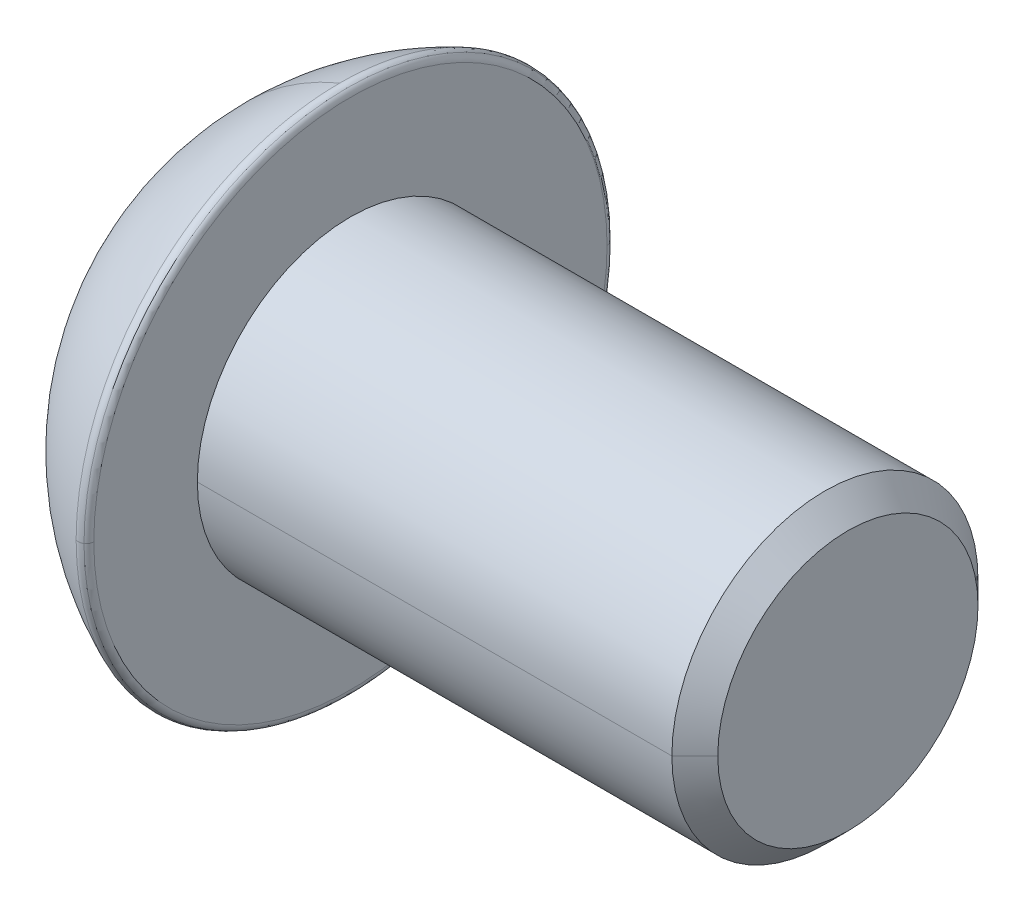
ISO-10303-21;
HEADER;
FILE_DESCRIPTION(('STEP AP214'),'2;1');
FILE_NAME('part.step','',(''),(''),'','','');
FILE_SCHEMA(('AUTOMOTIVE_DESIGN { 1 0 10303 214 1 1 1 1 }'));
ENDSEC;
DATA;
#1=APPLICATION_CONTEXT('core data for automotive mechanical design processes');
#2=APPLICATION_PROTOCOL_DEFINITION('international standard','automotive_design',2000,#1);
#3=PRODUCT_CONTEXT('',#1,'mechanical');
#4=PRODUCT('Part','Part','',(#3));
#5=PRODUCT_RELATED_PRODUCT_CATEGORY('part','',(#4));
#6=PRODUCT_DEFINITION_FORMATION('','',#4);
#7=PRODUCT_DEFINITION_CONTEXT('part definition',#1,'design');
#8=PRODUCT_DEFINITION('design','',#6,#7);
#9=PRODUCT_DEFINITION_SHAPE('','',#8);
#10=(LENGTH_UNIT() NAMED_UNIT(*) SI_UNIT(.MILLI.,.METRE.));
#11=(NAMED_UNIT(*) PLANE_ANGLE_UNIT() SI_UNIT($,.RADIAN.));
#12=(NAMED_UNIT(*) SI_UNIT($,.STERADIAN.) SOLID_ANGLE_UNIT());
#13=UNCERTAINTY_MEASURE_WITH_UNIT(LENGTH_MEASURE(1.E-05),#10,'distance_accuracy_value','');
#14=(GEOMETRIC_REPRESENTATION_CONTEXT(3) GLOBAL_UNCERTAINTY_ASSIGNED_CONTEXT((#13)) GLOBAL_UNIT_ASSIGNED_CONTEXT((#10,
#11,#12)) REPRESENTATION_CONTEXT('',''));
#15=CARTESIAN_POINT('',(0.,0.,0.));
#16=DIRECTION('',(0.,0.,1.));
#17=DIRECTION('',(1.,0.,0.));
#18=AXIS2_PLACEMENT_3D('',#15,#16,#17);
#19=CARTESIAN_POINT('',(1.6,1.25,2.165063509461));
#20=DIRECTION('',(-1.,0.,0.));
#21=DIRECTION('',(0.,0.,1.));
#22=AXIS2_PLACEMENT_3D('',#19,#20,#21);
#23=PLANE('',#22);
#24=DIRECTION('',(0.,0.,-1.));
#25=VECTOR('',#24,1.);
#26=CARTESIAN_POINT('',(1.6,-1.25,-0.721687836487));
#27=LINE('',#26,#25);
#28=CARTESIAN_POINT('',(1.6,-1.25000027522015,-0.721687677588506));
#29=VERTEX_POINT('',#28);
#30=CARTESIAN_POINT('',(1.6,-1.25,0.721687836487));
#31=VERTEX_POINT('',#30);
#32=EDGE_CURVE('E171',#29,#31,#27,.F.);
#33=ORIENTED_EDGE('',*,*,#32,.T.);
#34=DIRECTION('',(0.,-0.866025403784429,-0.500000000000017));
#35=VECTOR('',#34,1.);
#36=CARTESIAN_POINT('',(1.6,-1.25,0.721687836487));
#37=LINE('',#36,#35);
#38=CARTESIAN_POINT('',(1.6,0.,1.44337567297403));
#39=VERTEX_POINT('',#38);
#40=EDGE_CURVE('E165',#31,#39,#37,.F.);
#41=ORIENTED_EDGE('',*,*,#40,.T.);
#42=DIRECTION('',(0.,-0.866025403784429,0.500000000000017));
#43=VECTOR('',#42,1.);
#44=CARTESIAN_POINT('',(1.6,0.,1.443375672974));
#45=LINE('',#44,#43);
#46=CARTESIAN_POINT('',(1.6,1.25,0.721687836486936));
#47=VERTEX_POINT('',#46);
#48=EDGE_CURVE('E159',#39,#47,#45,.F.);
#49=ORIENTED_EDGE('',*,*,#48,.T.);
#50=DIRECTION('',(0.,0.,1.));
#51=VECTOR('',#50,1.);
#52=CARTESIAN_POINT('',(1.6,1.25,0.721687836487));
#53=LINE('',#52,#51);
#54=CARTESIAN_POINT('',(1.6,1.25,-0.721687836487));
#55=VERTEX_POINT('',#54);
#56=EDGE_CURVE('E124',#47,#55,#53,.F.);
#57=ORIENTED_EDGE('',*,*,#56,.T.);
#58=DIRECTION('',(0.,0.866025403784429,0.500000000000017));
#59=VECTOR('',#58,1.);
#60=CARTESIAN_POINT('',(1.6,1.25,-0.721687836487));
#61=LINE('',#60,#59);
#62=CARTESIAN_POINT('',(1.6,0.,-1.44337567297403));
#63=VERTEX_POINT('',#62);
#64=EDGE_CURVE('E120',#55,#63,#61,.F.);
#65=ORIENTED_EDGE('',*,*,#64,.T.);
#66=DIRECTION('',(0.,-0.866025403784429,0.500000000000017));
#67=VECTOR('',#66,1.);
#68=CARTESIAN_POINT('',(1.6,5.89521505678543E-06,-1.443379076578));
#69=LINE('',#68,#67);
#70=EDGE_CURVE('E20',#63,#29,#69,.T.);
#71=ORIENTED_EDGE('',*,*,#70,.T.);
#72=EDGE_LOOP('',(#33,#41,#49,#57,#65,#71));
#73=FACE_BOUND('',#72,.T.);
#74=ADVANCED_FACE('F17',(#73),#23,.T.);
#75=CARTESIAN_POINT('',(1.6,0.,-1.443375672974));
#76=DIRECTION('',(0.,-0.500000000000017,-0.866025403784429));
#77=DIRECTION('',(0.,0.866025403784429,-0.500000000000017));
#78=AXIS2_PLACEMENT_3D('',#75,#76,#77);
#79=PLANE('',#78);
#80=DIRECTION('',(1.,0.,0.));
#81=VECTOR('',#80,1.);
#82=CARTESIAN_POINT('',(1.6,-1.25000055044031,-0.721687518690077));
#83=LINE('',#82,#81);
#84=CARTESIAN_POINT('',(0.207033028378742,-1.24999952712232,-0.721688109502994));
#85=VERTEX_POINT('',#84);
#86=EDGE_CURVE('E136',#85,#29,#83,.T.);
#87=ORIENTED_EDGE('',*,*,#86,.T.);
#88=ORIENTED_EDGE('',*,*,#70,.F.);
#89=DIRECTION('',(-1.,0.,0.));
#90=VECTOR('',#89,1.);
#91=CARTESIAN_POINT('',(1.6,0.,-1.44337567297403));
#92=LINE('',#91,#90);
#93=CARTESIAN_POINT('',(0.207019228692631,6.36208226980284E-07,-1.44338431750813));
#94=VERTEX_POINT('',#93);
#95=EDGE_CURVE('E129',#63,#94,#92,.T.);
#96=ORIENTED_EDGE('',*,*,#95,.T.);
#97=CARTESIAN_POINT('',(0.207029974120473,7.36199577541169E-06,-1.44337992342424));
#98=CARTESIAN_POINT('',(0.22877708270887,-0.0557696443511096,-1.41117705379528));
#99=CARTESIAN_POINT('',(0.24859642471079,-0.11220494336702,-1.37859411871664));
#100=CARTESIAN_POINT('',(0.283149939912942,-0.226430788951877,-1.31264579601981));
#101=CARTESIAN_POINT('',(0.29786588663688,-0.28422542159371,-1.27927804930633));
#102=CARTESIAN_POINT('',(0.320421490831661,-0.398833581841157,-1.21310899713613));
#103=CARTESIAN_POINT('',(0.3284775622732,-0.455613840978867,-1.18032689923832));
#104=CARTESIAN_POINT('',(0.337641547328188,-0.569504152318693,-1.11457229732818));
#105=CARTESIAN_POINT('',(0.338762236662434,-0.626613404034279,-1.08160025547697));
#106=CARTESIAN_POINT('',(0.334362778173589,-0.731173382230786,-1.02123252391875));
#107=CARTESIAN_POINT('',(0.329909262767463,-0.778660904533319,-0.99381559013423));
#108=CARTESIAN_POINT('',(0.316466343827329,-0.873155793962911,-0.939258940285009));
#109=CARTESIAN_POINT('',(0.307475838793321,-0.92016304165899,-0.912119293173813));
#110=CARTESIAN_POINT('',(0.285246275436986,-1.01486945899548,-0.8574405176306));
#111=CARTESIAN_POINT('',(0.271887776803807,-1.06254703661479,-0.829913855357786));
#112=CARTESIAN_POINT('',(0.241798636437717,-1.15696261564561,-0.775402995388644));
#113=CARTESIAN_POINT('',(0.225077378691261,-1.20370284221079,-0.748417512999251));
#114=CARTESIAN_POINT('',(0.207028172057642,-1.25001198466558,-0.721680917137038));
#115=B_SPLINE_CURVE_WITH_KNOTS('',3,(#97,#98,#99,#100,#101,#102,#103,#104,#105,#106,#107,#108,
#109,#110,#111,#112,#113,#114),.UNSPECIFIED.,.F.,.F.,(4,2,2,2,2,2,2,2,4),(0.,0.204062456585252,
0.408846380866244,0.606680483702469,0.804150046069881,0.968992884767408,1.13387576362802,
1.30370847043041,1.47307366562871),.UNSPECIFIED.);
#116=EDGE_CURVE('E142',#94,#85,#115,.T.);
#117=ORIENTED_EDGE('',*,*,#116,.T.);
#118=EDGE_LOOP('',(#87,#88,#96,#117));
#119=FACE_BOUND('',#118,.T.);
#120=ADVANCED_FACE('F133',(#119),#79,.F.);
#121=CARTESIAN_POINT('',(1.6,-1.25,-0.721687836487));
#122=DIRECTION('',(0.,-1.,0.));
#123=DIRECTION('',(0.,0.,-1.));
#124=AXIS2_PLACEMENT_3D('',#121,#122,#123);
#125=PLANE('',#124);
#126=DIRECTION('',(1.,0.,0.));
#127=VECTOR('',#126,1.);
#128=CARTESIAN_POINT('',(1.6,-1.25,0.721687836487));
#129=LINE('',#128,#127);
#130=CARTESIAN_POINT('',(0.206914956676828,-1.2500917885575,0.721596826661148));
#131=VERTEX_POINT('',#130);
#132=EDGE_CURVE('E168',#131,#31,#129,.T.);
#133=ORIENTED_EDGE('',*,*,#132,.T.);
#134=ORIENTED_EDGE('',*,*,#32,.F.);
#135=ORIENTED_EDGE('',*,*,#86,.F.);
#136=CARTESIAN_POINT('',(0.207031160920142,-1.25,-0.721692822011834));
#137=CARTESIAN_POINT('',(0.228778164969564,-1.25,-0.657287160265051));
#138=CARTESIAN_POINT('',(0.248597396587641,-1.25,-0.592121368197402));
#139=CARTESIAN_POINT('',(0.283150684066797,-1.25,-0.460224891527207));
#140=CARTESIAN_POINT('',(0.29786651393915,-1.25,-0.393489488885404));
#141=CARTESIAN_POINT('',(0.320421902559959,-1.25,-0.261151510015199));
#142=CARTESIAN_POINT('',(0.328477869243167,-1.25,-0.195587347493372));
#143=CARTESIAN_POINT('',(0.337641645727044,-1.25,-0.064078215482473));
#144=CARTESIAN_POINT('',(0.338762230823647,-1.25,0.00186582973227819));
#145=CARTESIAN_POINT('',(0.33436278882051,-1.25,0.122595931634612));
#146=CARTESIAN_POINT('',(0.329909862420423,-1.25,0.177424497864469));
#147=CARTESIAN_POINT('',(0.316468963911251,-1.25,0.286527326827143));
#148=CARTESIAN_POINT('',(0.307479891091108,-1.25,0.340801451760196));
#149=CARTESIAN_POINT('',(0.285253925318202,-1.25,0.450148489971032));
#150=CARTESIAN_POINT('',(0.271897627328864,-1.25,0.505196480011395));
#151=CARTESIAN_POINT('',(0.241813359884529,-1.25,0.614207781890344));
#152=CARTESIAN_POINT('',(0.225094770487274,-1.25,0.668173661871663));
#153=CARTESIAN_POINT('',(0.207048365729195,-1.25,0.721641858838414));
#154=B_SPLINE_CURVE_WITH_KNOTS('',3,(#136,#137,#138,#139,#140,#141,#142,#143,#144,#145,#146,
#147,#148,#149,#150,#151,#152,#153),.UNSPECIFIED.,.F.,.F.,(4,2,2,2,2,2,2,2,4),(0.,
0.204062135564955,0.408845717743445,0.606679683645207,0.804149121439831,0.968976027479676,
1.13384294856399,1.30365857138595,1.47300685846462),.UNSPECIFIED.);
#155=EDGE_CURVE('E144',#85,#131,#154,.T.);
#156=ORIENTED_EDGE('',*,*,#155,.T.);
#157=EDGE_LOOP('',(#133,#134,#135,#156));
#158=FACE_BOUND('',#157,.T.);
#159=ADVANCED_FACE('F271',(#158),#125,.F.);
#160=CARTESIAN_POINT('',(1.6,-1.25,0.721687836487));
#161=DIRECTION('',(0.,-0.500000000000017,0.866025403784429));
#162=DIRECTION('',(0.,-0.866025403784429,-0.500000000000017));
#163=AXIS2_PLACEMENT_3D('',#160,#161,#162);
#164=PLANE('',#163);
#165=DIRECTION('',(1.,0.,0.));
#166=VECTOR('',#165,1.);
#167=CARTESIAN_POINT('',(1.6,0.,1.44337567297403));
#168=LINE('',#167,#166);
#169=CARTESIAN_POINT('',(0.206989347720655,-4.2355375795069E-06,1.44340553502234));
#170=VERTEX_POINT('',#169);
#171=EDGE_CURVE('E162',#170,#39,#168,.T.);
#172=ORIENTED_EDGE('',*,*,#171,.T.);
#173=ORIENTED_EDGE('',*,*,#40,.F.);
#174=ORIENTED_EDGE('',*,*,#132,.F.);
#175=CARTESIAN_POINT('',(0.206982896913737,-1.25012811650974,0.721613868385616));
#176=CARTESIAN_POINT('',(0.228733814513467,-1.19434932168866,0.753817770590641));
#177=CARTESIAN_POINT('',(0.248557253542929,-1.13791223196781,0.786401739533252));
#178=CARTESIAN_POINT('',(0.283119382722108,-1.02368253162543,0.852352287775376));
#179=CARTESIAN_POINT('',(0.297839838559711,-0.965885832290373,0.885721227694747));
#180=CARTESIAN_POINT('',(0.320404400908553,-0.851273546330508,0.951892661846116));
#181=CARTESIAN_POINT('',(0.328464944922873,-0.794491243652929,0.984675939582225));
#182=CARTESIAN_POINT('',(0.337637587260453,-0.680596477438627,1.05043311351534));
#183=CARTESIAN_POINT('',(0.338762466437565,-0.623484815433148,1.08340654694808));
#184=CARTESIAN_POINT('',(0.334369708895976,-0.518913754512515,1.14378067712005));
#185=CARTESIAN_POINT('',(0.329918170406245,-0.471417635873087,1.17120257400199));
#186=CARTESIAN_POINT('',(0.316477339176685,-0.376905587482605,1.2257691305819));
#187=CARTESIAN_POINT('',(0.307486943870036,-0.329889777239291,1.25291372128205));
#188=CARTESIAN_POINT('',(0.28525589219347,-0.23516583154672,1.30760261682636));
#189=CARTESIAN_POINT('',(0.271895715305504,-0.187479300292413,1.33513444848275));
#190=CARTESIAN_POINT('',(0.241801894918607,-0.0930461880354329,1.38965543126474));
#191=CARTESIAN_POINT('',(0.225077643219922,-0.0462973801002809,1.41664586811039));
#192=CARTESIAN_POINT('',(0.207024980398684,2.01718784551973E-05,1.44338731921352));
#193=B_SPLINE_CURVE_WITH_KNOTS('',3,(#175,#176,#177,#178,#179,#180,#181,#182,#183,#184,#185,
#186,#187,#188,#189,#190,#191,#192),.UNSPECIFIED.,.F.,.F.,(4,2,2,2,2,2,2,2,4),(0.,
0.2040719991809,0.40886586182628,0.606708635813811,0.804186721307347,0.969058629759092,
1.13397060773329,1.30383456905038,1.47323072784048),.UNSPECIFIED.);
#194=EDGE_CURVE('E258',#131,#170,#193,.T.);
#195=ORIENTED_EDGE('',*,*,#194,.T.);
#196=EDGE_LOOP('',(#172,#173,#174,#195));
#197=FACE_BOUND('',#196,.T.);
#198=ADVANCED_FACE('F265',(#197),#164,.F.);
#199=CARTESIAN_POINT('',(1.6,0.,1.443375672974));
#200=DIRECTION('',(0.,0.500000000000017,0.866025403784429));
#201=DIRECTION('',(0.,-0.866025403784429,0.500000000000017));
#202=AXIS2_PLACEMENT_3D('',#199,#200,#201);
#203=PLANE('',#202);
#204=DIRECTION('',(1.,0.,0.));
#205=VECTOR('',#204,1.);
#206=CARTESIAN_POINT('',(1.6,1.25,0.721687836486936));
#207=LINE('',#206,#205);
#208=CARTESIAN_POINT('',(0.206916762161275,1.25009288471258,0.721605510849358));
#209=VERTEX_POINT('',#208);
#210=EDGE_CURVE('E156',#209,#47,#207,.T.);
#211=ORIENTED_EDGE('',*,*,#210,.T.);
#212=ORIENTED_EDGE('',*,*,#48,.F.);
#213=ORIENTED_EDGE('',*,*,#171,.F.);
#214=CARTESIAN_POINT('',(0.207022757070233,-2.58752511379951E-05,1.44339061205721));
#215=CARTESIAN_POINT('',(0.228770468061506,0.0557514530054477,1.41118755657359));
#216=CARTESIAN_POINT('',(0.248590453556866,0.112187075237557,1.378604434886));
#217=CARTESIAN_POINT('',(0.283145312260212,0.226413617774199,1.31265570980386));
#218=CARTESIAN_POINT('',(0.29786195716185,0.284208624696181,1.27928774699964));
#219=CARTESIAN_POINT('',(0.320418912509655,0.398817427523105,1.21311832383601));
#220=CARTESIAN_POINT('',(0.328475652322654,0.455597950785069,1.18033607344599));
#221=CARTESIAN_POINT('',(0.337640943649968,0.56948883654224,1.11458113989584));
#222=CARTESIAN_POINT('',(0.338762272312536,0.626598398357914,1.08160891900825));
#223=CARTESIAN_POINT('',(0.334363439562073,0.731169527811789,1.02123474926859));
#224=CARTESIAN_POINT('',(0.329908843292613,0.77866784364366,0.993811583837007));
#225=CARTESIAN_POINT('',(0.316461753356583,0.873184069225234,0.939242615554696));
#226=CARTESIAN_POINT('',(0.307468156374413,0.920201859335002,0.912096881778119));
#227=CARTESIAN_POINT('',(0.285230652266929,1.01492972835245,0.857405721101132));
#228=CARTESIAN_POINT('',(0.271867220479929,1.06261819699437,0.829872770893481));
#229=CARTESIAN_POINT('',(0.241767061556014,1.15705505028219,0.77534962822633));
#230=CARTESIAN_POINT('',(0.225039727691357,1.20380566259134,0.748358149624863));
#231=CARTESIAN_POINT('',(0.206984110144319,1.25012500491411,0.721615664866127));
#232=B_SPLINE_CURVE_WITH_KNOTS('',3,(#214,#215,#216,#217,#218,#219,#220,#221,#222,#223,#224,
#225,#226,#227,#228,#229,#230,#231),.UNSPECIFIED.,.F.,.F.,(4,2,2,2,2,2,2,2,4),(0.,
0.204064093747883,0.408849739938516,0.606684995234939,0.804155668661313,0.969035889277068,
1.13395620739664,1.30382900629983,1.47323388376518),.UNSPECIFIED.);
#233=EDGE_CURVE('E257',#170,#209,#232,.T.);
#234=ORIENTED_EDGE('',*,*,#233,.T.);
#235=EDGE_LOOP('',(#211,#212,#213,#234));
#236=FACE_BOUND('',#235,.T.);
#237=ADVANCED_FACE('F260',(#236),#203,.F.);
#238=CARTESIAN_POINT('',(1.6,1.25,0.721687836487));
#239=DIRECTION('',(0.,1.,0.));
#240=DIRECTION('',(0.,0.,1.));
#241=AXIS2_PLACEMENT_3D('',#238,#239,#240);
#242=PLANE('',#241);
#243=DIRECTION('',(1.,0.,0.));
#244=VECTOR('',#243,1.);
#245=CARTESIAN_POINT('',(1.6,1.25,-0.721687836487));
#246=LINE('',#245,#244);
#247=CARTESIAN_POINT('',(0.20703207408439,1.25,-0.721690117334153));
#248=VERTEX_POINT('',#247);
#249=EDGE_CURVE('E130',#248,#55,#246,.T.);
#250=ORIENTED_EDGE('',*,*,#249,.T.);
#251=ORIENTED_EDGE('',*,*,#56,.F.);
#252=ORIENTED_EDGE('',*,*,#210,.F.);
#253=CARTESIAN_POINT('',(0.207045918606092,1.25,0.721649107925356));
#254=CARTESIAN_POINT('',(0.228791736113005,1.25,0.657244070684804));
#255=CARTESIAN_POINT('',(0.24860968961346,1.25,0.592078903479477));
#256=CARTESIAN_POINT('',(0.283160285960233,1.25,0.46018377139118));
#257=CARTESIAN_POINT('',(0.297874705014646,1.25,0.393449089358049));
#258=CARTESIAN_POINT('',(0.320427275942883,1.25,0.261112599124714));
#259=CARTESIAN_POINT('',(0.328481833259182,1.25,0.195549199890064));
#260=CARTESIAN_POINT('',(0.337642886973724,1.25,0.0640417324877461));
#261=CARTESIAN_POINT('',(0.33876215732379,1.25,-0.00190141176795496));
#262=CARTESIAN_POINT('',(0.33436044833659,1.25,-0.122632026396143));
#263=CARTESIAN_POINT('',(0.329906328700154,1.25,-0.177462016656382));
#264=CARTESIAN_POINT('',(0.31646291440792,1.25,-0.286567588302902));
#265=CARTESIAN_POINT('',(0.307472518691087,1.25,-0.340843031822908));
#266=CARTESIAN_POINT('',(0.28524382271332,1.25,-0.450192707233113));
#267=CARTESIAN_POINT('',(0.27188611269183,1.25,-0.505242012455315));
#268=CARTESIAN_POINT('',(0.241799042472446,1.25,-0.614255864505822));
#269=CARTESIAN_POINT('',(0.225079063234569,1.25,-0.668222979903195));
#270=CARTESIAN_POINT('',(0.207031304089396,1.25,-0.721692398118525));
#271=B_SPLINE_CURVE_WITH_KNOTS('',3,(#253,#254,#255,#256,#257,#258,#259,#260,#261,#262,#263,
#264,#265,#266,#267,#268,#269,#270),.UNSPECIFIED.,.F.,.F.,(4,2,2,2,2,2,2,2,4),(0.,
0.204059216415442,0.408839765335206,0.606670939697127,0.804137624611018,0.968969066756574,
1.13384053663494,1.30366099516533,1.47301405780841),.UNSPECIFIED.);
#272=EDGE_CURVE('E222',#209,#248,#271,.T.);
#273=ORIENTED_EDGE('',*,*,#272,.T.);
#274=EDGE_LOOP('',(#250,#251,#252,#273));
#275=FACE_BOUND('',#274,.T.);
#276=ADVANCED_FACE('F264',(#275),#242,.F.);
#277=CARTESIAN_POINT('',(1.6,1.25,-0.721687836487));
#278=DIRECTION('',(0.,0.500000000000017,-0.866025403784429));
#279=DIRECTION('',(0.,0.866025403784429,0.500000000000017));
#280=AXIS2_PLACEMENT_3D('',#277,#278,#279);
#281=PLANE('',#280);
#282=ORIENTED_EDGE('',*,*,#95,.F.);
#283=ORIENTED_EDGE('',*,*,#64,.F.);
#284=ORIENTED_EDGE('',*,*,#249,.F.);
#285=CARTESIAN_POINT('',(0.207027925070818,1.2500126183959,-0.721680551252728));
#286=CARTESIAN_POINT('',(0.228775198505051,1.19423553669676,-0.753883464386342));
#287=CARTESIAN_POINT('',(0.248594718050965,1.13780016228092,-0.786466442997143));
#288=CARTESIAN_POINT('',(0.283148607029435,1.02357415444486,-0.852414859369757));
#289=CARTESIAN_POINT('',(0.297864749677346,0.965779434844083,-0.885782656289004));
#290=CARTESIAN_POINT('',(0.320420744981027,0.851171095538349,-0.951951811838548));
#291=CARTESIAN_POINT('',(0.328477012016539,0.794390744881022,-0.984733962575239));
#292=CARTESIAN_POINT('',(0.33764137501002,0.68050023395859,-1.05048867971445));
#293=CARTESIAN_POINT('',(0.338762246878822,0.623390874223767,-1.0834607839306));
#294=CARTESIAN_POINT('',(0.334363101017464,0.51883090712891,-1.14382850907928));
#295=CARTESIAN_POINT('',(0.329909743898531,0.471343505383166,-1.1712453732603));
#296=CARTESIAN_POINT('',(0.31646715027323,0.376848845708256,-1.22580189046059));
#297=CARTESIAN_POINT('',(0.307476812306644,0.329841707203123,-1.25294147453037));
#298=CARTESIAN_POINT('',(0.285247586809734,0.235135506620879,-1.30762012493045));
#299=CARTESIAN_POINT('',(0.271889259239289,0.187458036239842,-1.33514672528923));
#300=CARTESIAN_POINT('',(0.241800452962458,0.0930426644504853,-1.38965746560745));
#301=CARTESIAN_POINT('',(0.225079358160444,0.0463025379278286,-1.41664289023727));
#302=CARTESIAN_POINT('',(0.207030308135077,-6.50533449024908E-06,-1.44337942883068));
#303=B_SPLINE_CURVE_WITH_KNOTS('',3,(#285,#286,#287,#288,#289,#290,#291,#292,#293,#294,#295,
#296,#297,#298,#299,#300,#301,#302),.UNSPECIFIED.,.F.,.F.,(4,2,2,2,2,2,2,2,4),(0.,
0.204062862845455,0.408847209358638,0.606681698856896,0.804151642418915,0.968994027378031,
1.13387645102044,1.30370867518,1.47307339413622),.UNSPECIFIED.);
#304=EDGE_CURVE('E140',#248,#94,#303,.T.);
#305=ORIENTED_EDGE('',*,*,#304,.T.);
#306=EDGE_LOOP('',(#282,#283,#284,#305));
#307=FACE_BOUND('',#306,.T.);
#308=ADVANCED_FACE('F138',(#307),#281,.F.);
#309=CARTESIAN_POINT('',(5.6843418860808E-11,0.,0.));
#310=DIRECTION('',(-1.,0.,0.));
#311=DIRECTION('',(0.,0.,1.));
#312=AXIS2_PLACEMENT_3D('',#309,#310,#311);
#313=CONICAL_SURFACE('',#312,1.74999999984493,0.976909054202291);
#314=DIRECTION('',(0.559586904163706,0.,-0.828771679468163));
#315=VECTOR('',#314,1.);
#316=CARTESIAN_POINT('',(-336923.778669411,0.,499000.));
#317=LINE('',#316,#315);
#318=CARTESIAN_POINT('',(-9.95898524079368E-12,0.,1.74999999998704));
#319=VERTEX_POINT('',#318);
#320=EDGE_CURVE('E287',#319,#170,#317,.T.);
#321=ORIENTED_EDGE('',*,*,#320,.T.);
#322=ORIENTED_EDGE('',*,*,#194,.F.);
#323=ORIENTED_EDGE('',*,*,#155,.F.);
#324=ORIENTED_EDGE('',*,*,#116,.F.);
#325=DIRECTION('',(0.559586904163706,0.,0.828771679468163));
#326=VECTOR('',#325,1.);
#327=CARTESIAN_POINT('',(-336923.778669411,6.11078570557366E-11,-499000.));
#328=LINE('',#327,#326);
#329=CARTESIAN_POINT('',(0.,0.,-1.75000000001546));
#330=VERTEX_POINT('',#329);
#331=EDGE_CURVE('E220',#94,#330,#328,.F.);
#332=ORIENTED_EDGE('',*,*,#331,.T.);
#333=CARTESIAN_POINT('',(-1.99179704815873E-11,0.,0.));
#334=DIRECTION('',(-1.,0.,0.));
#335=DIRECTION('',(0.,0.,1.));
#336=AXIS2_PLACEMENT_3D('',#333,#334,#335);
#337=CIRCLE('',#336,1.74999999995862);
#338=CARTESIAN_POINT('',(-1.99178931787647E-11,-1.74999999995958,0.));
#339=VERTEX_POINT('',#338);
#340=EDGE_CURVE('E211',#339,#330,#337,.F.);
#341=ORIENTED_EDGE('',*,*,#340,.F.);
#342=CARTESIAN_POINT('',(-1.99179704815873E-11,0.,0.));
#343=DIRECTION('',(-1.,0.,0.));
#344=DIRECTION('',(0.,0.,1.));
#345=AXIS2_PLACEMENT_3D('',#342,#343,#344);
#346=CIRCLE('',#345,1.74999999995862);
#347=EDGE_CURVE('E215',#319,#339,#346,.F.);
#348=ORIENTED_EDGE('',*,*,#347,.F.);
#349=EDGE_LOOP('',(#321,#322,#323,#324,#332,#341,#348));
#350=FACE_BOUND('',#349,.T.);
#351=ADVANCED_FACE('F238',(#350),#313,.F.);
#352=CARTESIAN_POINT('',(0.,0.,0.));
#353=DIRECTION('',(-1.,0.,0.));
#354=DIRECTION('',(0.,0.,1.));
#355=AXIS2_PLACEMENT_3D('',#352,#353,#354);
#356=CONICAL_SURFACE('',#355,1.75000000001546,0.976909054193789);
#357=ORIENTED_EDGE('',*,*,#331,.F.);
#358=ORIENTED_EDGE('',*,*,#304,.F.);
#359=ORIENTED_EDGE('',*,*,#272,.F.);
#360=ORIENTED_EDGE('',*,*,#233,.F.);
#361=ORIENTED_EDGE('',*,*,#320,.F.);
#362=CARTESIAN_POINT('',(0.,0.,0.));
#363=DIRECTION('',(-1.,0.,0.));
#364=DIRECTION('',(0.,0.,1.));
#365=AXIS2_PLACEMENT_3D('',#362,#363,#364);
#366=CIRCLE('',#365,1.75000000001546);
#367=CARTESIAN_POINT('',(0.,1.75000000001159,0.));
#368=VERTEX_POINT('',#367);
#369=EDGE_CURVE('E217',#368,#319,#366,.F.);
#370=ORIENTED_EDGE('',*,*,#369,.F.);
#371=CARTESIAN_POINT('',(0.,0.,0.));
#372=DIRECTION('',(-1.,0.,0.));
#373=DIRECTION('',(0.,0.,1.));
#374=AXIS2_PLACEMENT_3D('',#371,#372,#373);
#375=CIRCLE('',#374,1.75000000001546);
#376=EDGE_CURVE('E208',#330,#368,#375,.F.);
#377=ORIENTED_EDGE('',*,*,#376,.F.);
#378=EDGE_LOOP('',(#357,#358,#359,#360,#361,#370,#377));
#379=FACE_BOUND('',#378,.T.);
#380=ADVANCED_FACE('F233',(#379),#356,.F.);
#381=CARTESIAN_POINT('',(3.296875,0.,0.));
#382=DIRECTION('',(0.,1.,0.));
#383=DIRECTION('',(0.,0.,-1.));
#384=AXIS2_PLACEMENT_3D('',#381,#382,#383);
#385=SPHERICAL_SURFACE('',#384,3.732544007192);
#386=CARTESIAN_POINT('',(3.296875,0.,0.));
#387=DIRECTION('',(0.,0.,1.));
#388=DIRECTION('',(0.,1.,0.));
#389=AXIS2_PLACEMENT_3D('',#386,#387,#388);
#390=CIRCLE('',#389,3.732544007192);
#391=CARTESIAN_POINT('',(1.86154554501695,-3.4455353896431,0.));
#392=VERTEX_POINT('',#391);
#393=EDGE_CURVE('E214',#392,#339,#390,.F.);
#394=ORIENTED_EDGE('',*,*,#393,.F.);
#395=CARTESIAN_POINT('',(1.86154554501695,0.,0.));
#396=DIRECTION('',(-1.,0.,0.));
#397=DIRECTION('',(0.,0.,1.));
#398=AXIS2_PLACEMENT_3D('',#395,#396,#397);
#399=CIRCLE('',#398,3.4455353896431);
#400=CARTESIAN_POINT('',(1.86154554501695,0.,3.4455353896431));
#401=VERTEX_POINT('',#400);
#402=EDGE_CURVE('E202',#401,#392,#399,.F.);
#403=ORIENTED_EDGE('',*,*,#402,.F.);
#404=CARTESIAN_POINT('',(1.86154554501695,0.,0.));
#405=DIRECTION('',(-1.,0.,0.));
#406=DIRECTION('',(0.,0.,1.));
#407=AXIS2_PLACEMENT_3D('',#404,#405,#406);
#408=CIRCLE('',#407,3.4455353896431);
#409=CARTESIAN_POINT('',(1.86154554501695,3.4455353896431,0.));
#410=VERTEX_POINT('',#409);
#411=EDGE_CURVE('E198',#410,#401,#408,.F.);
#412=ORIENTED_EDGE('',*,*,#411,.F.);
#413=CARTESIAN_POINT('',(3.296875,0.,0.));
#414=DIRECTION('',(0.,0.,1.));
#415=DIRECTION('',(0.,1.,0.));
#416=AXIS2_PLACEMENT_3D('',#413,#414,#415);
#417=CIRCLE('',#416,3.732544007192);
#418=EDGE_CURVE('E207',#368,#410,#417,.F.);
#419=ORIENTED_EDGE('',*,*,#418,.F.);
#420=ORIENTED_EDGE('',*,*,#369,.T.);
#421=ORIENTED_EDGE('',*,*,#347,.T.);
#422=EDGE_LOOP('',(#394,#403,#412,#419,#420,#421));
#423=FACE_BOUND('',#422,.T.);
#424=ADVANCED_FACE('F237',(#423),#385,.T.);
#425=CARTESIAN_POINT('',(3.296875,0.,0.));
#426=DIRECTION('',(0.,1.,0.));
#427=DIRECTION('',(0.,0.,-1.));
#428=AXIS2_PLACEMENT_3D('',#425,#426,#427);
#429=SPHERICAL_SURFACE('',#428,3.732544007192);
#430=CARTESIAN_POINT('',(1.86154554501695,0.,0.));
#431=DIRECTION('',(-1.,0.,0.));
#432=DIRECTION('',(0.,0.,1.));
#433=AXIS2_PLACEMENT_3D('',#430,#431,#432);
#434=CIRCLE('',#433,3.4455353896431);
#435=CARTESIAN_POINT('',(1.86154554501695,0.,-3.4455353896431));
#436=VERTEX_POINT('',#435);
#437=EDGE_CURVE('E193',#436,#410,#434,.F.);
#438=ORIENTED_EDGE('',*,*,#437,.F.);
#439=CARTESIAN_POINT('',(1.86154554501695,0.,0.));
#440=DIRECTION('',(-1.,0.,0.));
#441=DIRECTION('',(0.,0.,1.));
#442=AXIS2_PLACEMENT_3D('',#439,#440,#441);
#443=CIRCLE('',#442,3.4455353896431);
#444=EDGE_CURVE('E205',#392,#436,#443,.F.);
#445=ORIENTED_EDGE('',*,*,#444,.F.);
#446=ORIENTED_EDGE('',*,*,#393,.T.);
#447=ORIENTED_EDGE('',*,*,#340,.T.);
#448=ORIENTED_EDGE('',*,*,#376,.T.);
#449=ORIENTED_EDGE('',*,*,#418,.T.);
#450=EDGE_LOOP('',(#438,#445,#446,#447,#448,#449));
#451=FACE_BOUND('',#450,.T.);
#452=ADVANCED_FACE('F319',(#451),#429,.T.);
#453=CARTESIAN_POINT('',(1.9,0.,0.));
#454=DIRECTION('',(-1.,0.,0.));
#455=DIRECTION('',(0.,0.,1.));
#456=AXIS2_PLACEMENT_3D('',#453,#454,#455);
#457=TOROIDAL_SURFACE('',#456,3.353224746205,0.1);
#458=CARTESIAN_POINT('',(1.9,0.,3.353224746205));
#459=DIRECTION('',(0.,1.,0.));
#460=DIRECTION('',(0.,0.,1.));
#461=AXIS2_PLACEMENT_3D('',#458,#459,#460);
#462=CIRCLE('',#461,0.1);
#463=CARTESIAN_POINT('',(1.95547321201116,0.,3.43642764729123));
#464=VERTEX_POINT('',#463);
#465=EDGE_CURVE('E201',#401,#464,#462,.T.);
#466=ORIENTED_EDGE('',*,*,#465,.F.);
#467=ORIENTED_EDGE('',*,*,#402,.T.);
#468=ORIENTED_EDGE('',*,*,#444,.T.);
#469=CARTESIAN_POINT('',(1.9,0.,-3.353224746205));
#470=DIRECTION('',(0.,-1.,0.));
#471=DIRECTION('',(0.,0.,-1.));
#472=AXIS2_PLACEMENT_3D('',#469,#470,#471);
#473=CIRCLE('',#472,0.1);
#474=CARTESIAN_POINT('',(1.95547321201116,0.,-3.43642764729123));
#475=VERTEX_POINT('',#474);
#476=EDGE_CURVE('E197',#475,#436,#473,.F.);
#477=ORIENTED_EDGE('',*,*,#476,.F.);
#478=CARTESIAN_POINT('',(1.95547321201116,0.,0.));
#479=DIRECTION('',(-1.,0.,0.));
#480=DIRECTION('',(0.,0.,1.));
#481=AXIS2_PLACEMENT_3D('',#478,#479,#480);
#482=CIRCLE('',#481,3.43642764729123);
#483=EDGE_CURVE('E196',#464,#475,#482,.F.);
#484=ORIENTED_EDGE('',*,*,#483,.F.);
#485=EDGE_LOOP('',(#466,#467,#468,#477,#484));
#486=FACE_BOUND('',#485,.T.);
#487=ADVANCED_FACE('F322',(#486),#457,.T.);
#488=CARTESIAN_POINT('',(1.9,0.,0.));
#489=DIRECTION('',(-1.,0.,0.));
#490=DIRECTION('',(0.,0.,1.));
#491=AXIS2_PLACEMENT_3D('',#488,#489,#490);
#492=TOROIDAL_SURFACE('',#491,3.353224746205,0.1);
#493=ORIENTED_EDGE('',*,*,#476,.T.);
#494=ORIENTED_EDGE('',*,*,#437,.T.);
#495=ORIENTED_EDGE('',*,*,#411,.T.);
#496=ORIENTED_EDGE('',*,*,#465,.T.);
#497=CARTESIAN_POINT('',(1.95547321201116,0.,0.));
#498=DIRECTION('',(-1.,0.,0.));
#499=DIRECTION('',(0.,0.,1.));
#500=AXIS2_PLACEMENT_3D('',#497,#498,#499);
#501=CIRCLE('',#500,3.43642764729123);
#502=EDGE_CURVE('E350',#475,#464,#501,.F.);
#503=ORIENTED_EDGE('',*,*,#502,.F.);
#504=EDGE_LOOP('',(#493,#494,#495,#496,#503));
#505=FACE_BOUND('',#504,.T.);
#506=ADVANCED_FACE('F326',(#505),#492,.T.);
#507=CARTESIAN_POINT('',(1.9,0.,0.));
#508=DIRECTION('',(-1.,0.,0.));
#509=DIRECTION('',(0.,0.,1.));
#510=AXIS2_PLACEMENT_3D('',#507,#508,#509);
#511=TOROIDAL_SURFACE('',#510,3.353224746205,0.1);
#512=CARTESIAN_POINT('',(1.9,0.,-3.353224746205));
#513=DIRECTION('',(0.,-1.,0.));
#514=DIRECTION('',(0.,0.,-1.));
#515=AXIS2_PLACEMENT_3D('',#512,#513,#514);
#516=CIRCLE('',#515,0.1);
#517=CARTESIAN_POINT('',(2.,0.,-3.353224746205));
#518=VERTEX_POINT('',#517);
#519=EDGE_CURVE('E357',#518,#475,#516,.F.);
#520=ORIENTED_EDGE('',*,*,#519,.F.);
#521=CARTESIAN_POINT('',(2.,0.,0.));
#522=DIRECTION('',(-1.,0.,0.));
#523=DIRECTION('',(0.,0.,-1.));
#524=AXIS2_PLACEMENT_3D('',#521,#522,#523);
#525=CIRCLE('',#524,3.353224746205);
#526=CARTESIAN_POINT('',(2.,0.,3.353224746205));
#527=VERTEX_POINT('',#526);
#528=EDGE_CURVE('E191',#518,#527,#525,.T.);
#529=ORIENTED_EDGE('',*,*,#528,.T.);
#530=CARTESIAN_POINT('',(1.9,0.,3.353224746205));
#531=DIRECTION('',(0.,1.,0.));
#532=DIRECTION('',(0.,0.,1.));
#533=AXIS2_PLACEMENT_3D('',#530,#531,#532);
#534=CIRCLE('',#533,0.1);
#535=EDGE_CURVE('E360',#464,#527,#534,.T.);
#536=ORIENTED_EDGE('',*,*,#535,.F.);
#537=ORIENTED_EDGE('',*,*,#483,.T.);
#538=EDGE_LOOP('',(#520,#529,#536,#537));
#539=FACE_BOUND('',#538,.T.);
#540=ADVANCED_FACE('F331',(#539),#511,.T.);
#541=CARTESIAN_POINT('',(1.9,0.,0.));
#542=DIRECTION('',(-1.,0.,0.));
#543=DIRECTION('',(0.,0.,1.));
#544=AXIS2_PLACEMENT_3D('',#541,#542,#543);
#545=TOROIDAL_SURFACE('',#544,3.353224746205,0.1);
#546=ORIENTED_EDGE('',*,*,#535,.T.);
#547=CARTESIAN_POINT('',(2.,0.,0.));
#548=DIRECTION('',(-1.,0.,0.));
#549=DIRECTION('',(0.,0.,1.));
#550=AXIS2_PLACEMENT_3D('',#547,#548,#549);
#551=CIRCLE('',#550,3.353224746205);
#552=EDGE_CURVE('E187',#527,#518,#551,.T.);
#553=ORIENTED_EDGE('',*,*,#552,.T.);
#554=ORIENTED_EDGE('',*,*,#519,.T.);
#555=ORIENTED_EDGE('',*,*,#502,.T.);
#556=EDGE_LOOP('',(#546,#553,#554,#555));
#557=FACE_BOUND('',#556,.T.);
#558=ADVANCED_FACE('F385',(#557),#545,.T.);
#559=CARTESIAN_POINT('',(8.20000000004484,0.,0.));
#560=DIRECTION('',(-1.,0.,0.));
#561=DIRECTION('',(0.,0.,1.));
#562=AXIS2_PLACEMENT_3D('',#559,#560,#561);
#563=CONICAL_SURFACE('',#562,1.99999999989587,0.785398163397448);
#564=DIRECTION('',(0.707106781186653,0.,-0.707106781186443));
#565=VECTOR('',#564,1.);
#566=CARTESIAN_POINT('',(-498989.800000148,0.,499000.));
#567=LINE('',#566,#565);
#568=CARTESIAN_POINT('',(8.2000000000026,0.,1.99999999997396));
#569=VERTEX_POINT('',#568);
#570=CARTESIAN_POINT('',(8.49999999996953,0.,1.69999999997117));
#571=VERTEX_POINT('',#570);
#572=EDGE_CURVE('E192',#569,#571,#567,.T.);
#573=ORIENTED_EDGE('',*,*,#572,.T.);
#574=CARTESIAN_POINT('',(8.49999999996953,0.,0.));
#575=DIRECTION('',(-1.,0.,0.));
#576=DIRECTION('',(0.,0.,1.));
#577=AXIS2_PLACEMENT_3D('',#574,#575,#576);
#578=CIRCLE('',#577,1.69999999997117);
#579=CARTESIAN_POINT('',(8.49999999996953,0.,-1.69999999997117));
#580=VERTEX_POINT('',#579);
#581=EDGE_CURVE('E188',#580,#571,#578,.F.);
#582=ORIENTED_EDGE('',*,*,#581,.F.);
#583=DIRECTION('',(0.707106781186653,0.,0.707106781186443));
#584=VECTOR('',#583,1.);
#585=CARTESIAN_POINT('',(-498989.800000148,6.11078570557366E-11,-499000.));
#586=LINE('',#585,#584);
#587=CARTESIAN_POINT('',(8.20000000000691,0.,-1.99999999997396));
#588=VERTEX_POINT('',#587);
#589=EDGE_CURVE('E35',#580,#588,#586,.F.);
#590=ORIENTED_EDGE('',*,*,#589,.T.);
#591=CARTESIAN_POINT('',(8.2,0.,0.));
#592=DIRECTION('',(-1.,0.,0.));
#593=DIRECTION('',(0.,0.,1.));
#594=AXIS2_PLACEMENT_3D('',#591,#592,#593);
#595=CIRCLE('',#594,2.);
#596=EDGE_CURVE('E184',#569,#588,#595,.T.);
#597=ORIENTED_EDGE('',*,*,#596,.F.);
#598=EDGE_LOOP('',(#573,#582,#590,#597));
#599=FACE_BOUND('',#598,.T.);
#600=ADVANCED_FACE('F394',(#599),#563,.T.);
#601=CARTESIAN_POINT('',(8.5,2.,0.));
#602=DIRECTION('',(1.,0.,0.));
#603=DIRECTION('',(0.,0.,-1.));
#604=AXIS2_PLACEMENT_3D('',#601,#602,#603);
#605=PLANE('',#604);
#606=CARTESIAN_POINT('',(8.49999999996953,0.,0.));
#607=DIRECTION('',(-1.,0.,0.));
#608=DIRECTION('',(0.,0.,1.));
#609=AXIS2_PLACEMENT_3D('',#606,#607,#608);
#610=CIRCLE('',#609,1.69999999997117);
#611=EDGE_CURVE('E181',#580,#571,#610,.T.);
#612=ORIENTED_EDGE('',*,*,#611,.F.);
#613=ORIENTED_EDGE('',*,*,#581,.T.);
#614=EDGE_LOOP('',(#612,#613));
#615=FACE_BOUND('',#614,.T.);
#616=ADVANCED_FACE('F397',(#615),#605,.T.);
#617=CARTESIAN_POINT('',(2.,2.,0.));
#618=DIRECTION('',(-1.,0.,0.));
#619=DIRECTION('',(0.,0.,1.));
#620=AXIS2_PLACEMENT_3D('',#617,#618,#619);
#621=PLANE('',#620);
#622=CARTESIAN_POINT('',(2.,0.,0.));
#623=DIRECTION('',(-1.,0.,0.));
#624=DIRECTION('',(0.,0.,1.));
#625=AXIS2_PLACEMENT_3D('',#622,#623,#624);
#626=CIRCLE('',#625,2.);
#627=CARTESIAN_POINT('',(2.,0.,-2.));
#628=VERTEX_POINT('',#627);
#629=CARTESIAN_POINT('',(2.,0.,2.));
#630=VERTEX_POINT('',#629);
#631=EDGE_CURVE('E185',#628,#630,#626,.F.);
#632=ORIENTED_EDGE('',*,*,#631,.F.);
#633=CARTESIAN_POINT('',(2.,0.,0.));
#634=DIRECTION('',(-1.,0.,0.));
#635=DIRECTION('',(0.,0.,1.));
#636=AXIS2_PLACEMENT_3D('',#633,#634,#635);
#637=CIRCLE('',#636,2.);
#638=EDGE_CURVE('E177',#630,#628,#637,.F.);
#639=ORIENTED_EDGE('',*,*,#638,.F.);
#640=EDGE_LOOP('',(#632,#639));
#641=FACE_BOUND('',#640,.T.);
#642=ORIENTED_EDGE('',*,*,#528,.F.);
#643=ORIENTED_EDGE('',*,*,#552,.F.);
#644=EDGE_LOOP('',(#642,#643));
#645=FACE_BOUND('',#644,.T.);
#646=ADVANCED_FACE('F400',(#641,#645),#621,.F.);
#647=CARTESIAN_POINT('',(-17.,0.,0.));
#648=DIRECTION('',(-1.,0.,0.));
#649=DIRECTION('',(0.,0.,1.));
#650=AXIS2_PLACEMENT_3D('',#647,#648,#649);
#651=CYLINDRICAL_SURFACE('',#650,2.);
#652=DIRECTION('',(-1.,0.,0.));
#653=VECTOR('',#652,1.);
#654=CARTESIAN_POINT('',(-17.,0.,2.));
#655=LINE('',#654,#653);
#656=EDGE_CURVE('E180',#569,#630,#655,.T.);
#657=ORIENTED_EDGE('',*,*,#656,.F.);
#658=ORIENTED_EDGE('',*,*,#596,.T.);
#659=DIRECTION('',(-1.,0.,0.));
#660=VECTOR('',#659,1.);
#661=CARTESIAN_POINT('',(-17.,0.,-2.));
#662=LINE('',#661,#660);
#663=EDGE_CURVE('E26',#628,#588,#662,.F.);
#664=ORIENTED_EDGE('',*,*,#663,.F.);
#665=ORIENTED_EDGE('',*,*,#631,.T.);
#666=EDGE_LOOP('',(#657,#658,#664,#665));
#667=FACE_BOUND('',#666,.T.);
#668=ADVANCED_FACE('F405',(#667),#651,.T.);
#669=CARTESIAN_POINT('',(8.20000000004484,0.,0.));
#670=DIRECTION('',(-1.,0.,0.));
#671=DIRECTION('',(0.,0.,1.));
#672=AXIS2_PLACEMENT_3D('',#669,#670,#671);
#673=CONICAL_SURFACE('',#672,1.99999999989587,0.785398163397448);
#674=ORIENTED_EDGE('',*,*,#589,.F.);
#675=ORIENTED_EDGE('',*,*,#611,.T.);
#676=ORIENTED_EDGE('',*,*,#572,.F.);
#677=CARTESIAN_POINT('',(8.2,0.,0.));
#678=DIRECTION('',(-1.,0.,0.));
#679=DIRECTION('',(0.,0.,1.));
#680=AXIS2_PLACEMENT_3D('',#677,#678,#679);
#681=CIRCLE('',#680,2.);
#682=EDGE_CURVE('E11',#588,#569,#681,.T.);
#683=ORIENTED_EDGE('',*,*,#682,.F.);
#684=EDGE_LOOP('',(#674,#675,#676,#683));
#685=FACE_BOUND('',#684,.T.);
#686=ADVANCED_FACE('F441',(#685),#673,.T.);
#687=CARTESIAN_POINT('',(-17.,0.,0.));
#688=DIRECTION('',(-1.,0.,0.));
#689=DIRECTION('',(0.,0.,1.));
#690=AXIS2_PLACEMENT_3D('',#687,#688,#689);
#691=CYLINDRICAL_SURFACE('',#690,2.);
#692=ORIENTED_EDGE('',*,*,#663,.T.);
#693=ORIENTED_EDGE('',*,*,#682,.T.);
#694=ORIENTED_EDGE('',*,*,#656,.T.);
#695=ORIENTED_EDGE('',*,*,#638,.T.);
#696=EDGE_LOOP('',(#692,#693,#694,#695));
#697=FACE_BOUND('',#696,.T.);
#698=ADVANCED_FACE('F444',(#697),#691,.T.);
#699=CLOSED_SHELL('',(#74,#120,#159,#198,#237,#276,#308,#351,#380,#424,#452,#487,#506,#540,#558,
#600,#616,#646,#668,#686,#698));
#700=MANIFOLD_SOLID_BREP('B1',#699);
#701=ADVANCED_BREP_SHAPE_REPRESENTATION('',(#18,#700),#14);
#702=SHAPE_DEFINITION_REPRESENTATION(#9,#701);
ENDSEC;
END-ISO-10303-21;
